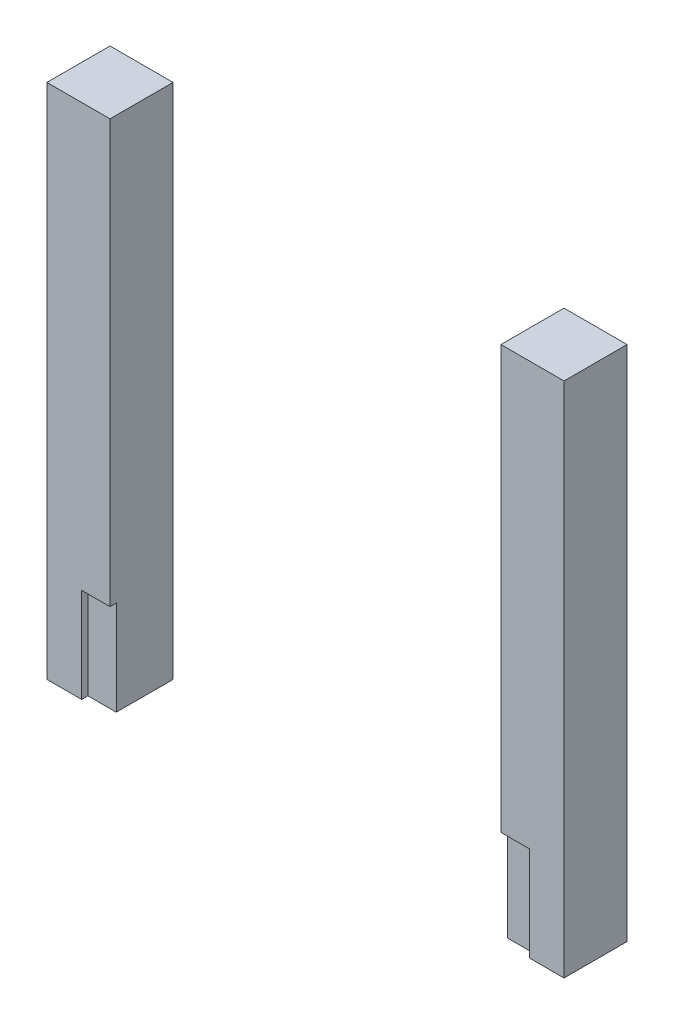
ISO-10303-21;
HEADER;
FILE_DESCRIPTION(('STEP AP214'),'2;1');
FILE_NAME('part.step','',(''),(''),'','','');
FILE_SCHEMA(('AUTOMOTIVE_DESIGN { 1 0 10303 214 1 1 1 1 }'));
ENDSEC;
DATA;
#1=APPLICATION_CONTEXT('core data for automotive mechanical design processes');
#2=APPLICATION_PROTOCOL_DEFINITION('international standard','automotive_design',2000,#1);
#3=PRODUCT_CONTEXT('',#1,'mechanical');
#4=PRODUCT('Part','Part','',(#3));
#5=PRODUCT_RELATED_PRODUCT_CATEGORY('part','',(#4));
#6=PRODUCT_DEFINITION_FORMATION('','',#4);
#7=PRODUCT_DEFINITION_CONTEXT('part definition',#1,'design');
#8=PRODUCT_DEFINITION('design','',#6,#7);
#9=PRODUCT_DEFINITION_SHAPE('','',#8);
#10=(LENGTH_UNIT() NAMED_UNIT(*) SI_UNIT(.MILLI.,.METRE.));
#11=(NAMED_UNIT(*) PLANE_ANGLE_UNIT() SI_UNIT($,.RADIAN.));
#12=(NAMED_UNIT(*) SI_UNIT($,.STERADIAN.) SOLID_ANGLE_UNIT());
#13=UNCERTAINTY_MEASURE_WITH_UNIT(LENGTH_MEASURE(1.E-05),#10,'distance_accuracy_value','');
#14=(GEOMETRIC_REPRESENTATION_CONTEXT(3) GLOBAL_UNCERTAINTY_ASSIGNED_CONTEXT((#13)) GLOBAL_UNIT_ASSIGNED_CONTEXT((#10,
#11,#12)) REPRESENTATION_CONTEXT('',''));
#15=CARTESIAN_POINT('',(0.,0.,0.));
#16=DIRECTION('',(0.,0.,1.));
#17=DIRECTION('',(1.,0.,0.));
#18=AXIS2_PLACEMENT_3D('',#15,#16,#17);
#19=CARTESIAN_POINT('',(0.,0.,50.));
#20=DIRECTION('',(0.,0.,1.));
#21=DIRECTION('',(1.,0.,0.));
#22=AXIS2_PLACEMENT_3D('',#19,#20,#21);
#23=PLANE('',#22);
#24=DIRECTION('',(0.,-1.,0.));
#25=VECTOR('',#24,1.);
#26=CARTESIAN_POINT('',(310.,410.,50.));
#27=LINE('',#26,#25);
#28=CARTESIAN_POINT('',(310.,410.,50.));
#29=VERTEX_POINT('',#28);
#30=CARTESIAN_POINT('',(310.,-260.,50.));
#31=VERTEX_POINT('',#30);
#32=EDGE_CURVE('E145',#29,#31,#27,.T.);
#33=ORIENTED_EDGE('',*,*,#32,.T.);
#34=DIRECTION('',(-1.,0.,0.));
#35=VECTOR('',#34,1.);
#36=CARTESIAN_POINT('',(-355.,-260.,50.));
#37=LINE('',#36,#35);
#38=CARTESIAN_POINT('',(355.,-260.,50.));
#39=VERTEX_POINT('',#38);
#40=EDGE_CURVE('E50',#39,#31,#37,.T.);
#41=ORIENTED_EDGE('',*,*,#40,.F.);
#42=DIRECTION('',(0.,1.,0.));
#43=VECTOR('',#42,1.);
#44=CARTESIAN_POINT('',(355.,-260.,50.));
#45=LINE('',#44,#43);
#46=CARTESIAN_POINT('',(355.,-410.,50.));
#47=VERTEX_POINT('',#46);
#48=EDGE_CURVE('E142',#47,#39,#45,.T.);
#49=ORIENTED_EDGE('',*,*,#48,.F.);
#50=DIRECTION('',(1.,0.,0.));
#51=VECTOR('',#50,1.);
#52=CARTESIAN_POINT('',(-410.,-410.,50.));
#53=LINE('',#52,#51);
#54=CARTESIAN_POINT('',(410.,-410.,50.));
#55=VERTEX_POINT('',#54);
#56=EDGE_CURVE('E146',#47,#55,#53,.T.);
#57=ORIENTED_EDGE('',*,*,#56,.T.);
#58=DIRECTION('',(0.,1.,0.));
#59=VECTOR('',#58,1.);
#60=CARTESIAN_POINT('',(410.,410.,50.));
#61=LINE('',#60,#59);
#62=CARTESIAN_POINT('',(410.,410.,50.));
#63=VERTEX_POINT('',#62);
#64=EDGE_CURVE('E147',#55,#63,#61,.T.);
#65=ORIENTED_EDGE('',*,*,#64,.T.);
#66=DIRECTION('',(-1.,0.,0.));
#67=VECTOR('',#66,1.);
#68=CARTESIAN_POINT('',(-410.,410.,50.));
#69=LINE('',#68,#67);
#70=EDGE_CURVE('E113',#63,#29,#69,.T.);
#71=ORIENTED_EDGE('',*,*,#70,.T.);
#72=EDGE_LOOP('',(#33,#41,#49,#57,#65,#71));
#73=FACE_BOUND('',#72,.T.);
#74=ADVANCED_FACE('F47',(#73),#23,.T.);
#75=CARTESIAN_POINT('',(0.,0.,-50.));
#76=DIRECTION('',(0.,0.,1.));
#77=DIRECTION('',(1.,0.,0.));
#78=AXIS2_PLACEMENT_3D('',#75,#76,#77);
#79=PLANE('',#78);
#80=DIRECTION('',(1.,0.,0.));
#81=VECTOR('',#80,1.);
#82=CARTESIAN_POINT('',(-410.,-410.,-50.));
#83=LINE('',#82,#81);
#84=CARTESIAN_POINT('',(310.,-410.,-50.));
#85=VERTEX_POINT('',#84);
#86=CARTESIAN_POINT('',(410.,-410.,-50.));
#87=VERTEX_POINT('',#86);
#88=EDGE_CURVE('E118',#85,#87,#83,.T.);
#89=ORIENTED_EDGE('',*,*,#88,.F.);
#90=DIRECTION('',(0.,1.,0.));
#91=VECTOR('',#90,1.);
#92=CARTESIAN_POINT('',(310.,310.,-50.));
#93=LINE('',#92,#91);
#94=CARTESIAN_POINT('',(310.,410.,-50.));
#95=VERTEX_POINT('',#94);
#96=EDGE_CURVE('E65',#85,#95,#93,.T.);
#97=ORIENTED_EDGE('',*,*,#96,.T.);
#98=DIRECTION('',(-1.,0.,0.));
#99=VECTOR('',#98,1.);
#100=CARTESIAN_POINT('',(-410.,410.,-50.));
#101=LINE('',#100,#99);
#102=CARTESIAN_POINT('',(410.,410.,-50.));
#103=VERTEX_POINT('',#102);
#104=EDGE_CURVE('E112',#103,#95,#101,.T.);
#105=ORIENTED_EDGE('',*,*,#104,.F.);
#106=DIRECTION('',(0.,1.,0.));
#107=VECTOR('',#106,1.);
#108=CARTESIAN_POINT('',(410.,410.,-50.));
#109=LINE('',#108,#107);
#110=EDGE_CURVE('E127',#87,#103,#109,.T.);
#111=ORIENTED_EDGE('',*,*,#110,.F.);
#112=EDGE_LOOP('',(#89,#97,#105,#111));
#113=FACE_BOUND('',#112,.T.);
#114=ADVANCED_FACE('F125',(#113),#79,.F.);
#115=CARTESIAN_POINT('',(-410.,410.,50.));
#116=DIRECTION('',(0.,-1.,0.));
#117=DIRECTION('',(1.,0.,0.));
#118=AXIS2_PLACEMENT_3D('',#115,#116,#117);
#119=PLANE('',#118);
#120=ORIENTED_EDGE('',*,*,#104,.T.);
#121=DIRECTION('',(0.,0.,-1.));
#122=VECTOR('',#121,1.);
#123=CARTESIAN_POINT('',(310.,410.,50.));
#124=LINE('',#123,#122);
#125=EDGE_CURVE('E12',#29,#95,#124,.T.);
#126=ORIENTED_EDGE('',*,*,#125,.F.);
#127=ORIENTED_EDGE('',*,*,#70,.F.);
#128=DIRECTION('',(0.,0.,-1.));
#129=VECTOR('',#128,1.);
#130=CARTESIAN_POINT('',(410.,410.,50.));
#131=LINE('',#130,#129);
#132=EDGE_CURVE('E122',#63,#103,#131,.T.);
#133=ORIENTED_EDGE('',*,*,#132,.T.);
#134=EDGE_LOOP('',(#120,#126,#127,#133));
#135=FACE_BOUND('',#134,.T.);
#136=ADVANCED_FACE('F169',(#135),#119,.F.);
#137=CARTESIAN_POINT('',(-410.,-410.,50.));
#138=DIRECTION('',(0.,1.,0.));
#139=DIRECTION('',(0.,0.,1.));
#140=AXIS2_PLACEMENT_3D('',#137,#138,#139);
#141=PLANE('',#140);
#142=DIRECTION('',(1.,0.,0.));
#143=VECTOR('',#142,1.);
#144=CARTESIAN_POINT('',(-355.,-410.,40.));
#145=LINE('',#144,#143);
#146=CARTESIAN_POINT('',(310.,-410.,40.));
#147=VERTEX_POINT('',#146);
#148=CARTESIAN_POINT('',(355.,-410.,40.));
#149=VERTEX_POINT('',#148);
#150=EDGE_CURVE('E121',#147,#149,#145,.T.);
#151=ORIENTED_EDGE('',*,*,#150,.F.);
#152=DIRECTION('',(0.,0.,-1.));
#153=VECTOR('',#152,1.);
#154=CARTESIAN_POINT('',(310.,-410.,50.));
#155=LINE('',#154,#153);
#156=EDGE_CURVE('E108',#147,#85,#155,.T.);
#157=ORIENTED_EDGE('',*,*,#156,.T.);
#158=ORIENTED_EDGE('',*,*,#88,.T.);
#159=DIRECTION('',(0.,0.,-1.));
#160=VECTOR('',#159,1.);
#161=CARTESIAN_POINT('',(410.,-410.,50.));
#162=LINE('',#161,#160);
#163=EDGE_CURVE('E137',#55,#87,#162,.T.);
#164=ORIENTED_EDGE('',*,*,#163,.F.);
#165=ORIENTED_EDGE('',*,*,#56,.F.);
#166=DIRECTION('',(0.,0.,1.));
#167=VECTOR('',#166,1.);
#168=CARTESIAN_POINT('',(355.,-410.,40.));
#169=LINE('',#168,#167);
#170=EDGE_CURVE('E56',#149,#47,#169,.T.);
#171=ORIENTED_EDGE('',*,*,#170,.F.);
#172=EDGE_LOOP('',(#151,#157,#158,#164,#165,#171));
#173=FACE_BOUND('',#172,.T.);
#174=ADVANCED_FACE('F116',(#173),#141,.F.);
#175=CARTESIAN_POINT('',(0.,0.,40.));
#176=DIRECTION('',(0.,0.,1.));
#177=DIRECTION('',(1.,0.,0.));
#178=AXIS2_PLACEMENT_3D('',#175,#176,#177);
#179=PLANE('',#178);
#180=DIRECTION('',(0.,1.,0.));
#181=VECTOR('',#180,1.);
#182=CARTESIAN_POINT('',(310.,310.,40.));
#183=LINE('',#182,#181);
#184=CARTESIAN_POINT('',(310.,-260.,40.));
#185=VERTEX_POINT('',#184);
#186=EDGE_CURVE('E102',#147,#185,#183,.T.);
#187=ORIENTED_EDGE('',*,*,#186,.F.);
#188=ORIENTED_EDGE('',*,*,#150,.T.);
#189=DIRECTION('',(0.,1.,0.));
#190=VECTOR('',#189,1.);
#191=CARTESIAN_POINT('',(355.,-260.,40.));
#192=LINE('',#191,#190);
#193=CARTESIAN_POINT('',(355.,-260.,40.));
#194=VERTEX_POINT('',#193);
#195=EDGE_CURVE('E129',#149,#194,#192,.T.);
#196=ORIENTED_EDGE('',*,*,#195,.T.);
#197=DIRECTION('',(-1.,0.,0.));
#198=VECTOR('',#197,1.);
#199=CARTESIAN_POINT('',(-355.,-260.,40.));
#200=LINE('',#199,#198);
#201=EDGE_CURVE('E134',#194,#185,#200,.T.);
#202=ORIENTED_EDGE('',*,*,#201,.T.);
#203=EDGE_LOOP('',(#187,#188,#196,#202));
#204=FACE_BOUND('',#203,.T.);
#205=ADVANCED_FACE('F182',(#204),#179,.T.);
#206=CARTESIAN_POINT('',(410.,410.,50.));
#207=DIRECTION('',(-1.,0.,0.));
#208=DIRECTION('',(0.,-1.,0.));
#209=AXIS2_PLACEMENT_3D('',#206,#207,#208);
#210=PLANE('',#209);
#211=ORIENTED_EDGE('',*,*,#110,.T.);
#212=ORIENTED_EDGE('',*,*,#132,.F.);
#213=ORIENTED_EDGE('',*,*,#64,.F.);
#214=ORIENTED_EDGE('',*,*,#163,.T.);
#215=EDGE_LOOP('',(#211,#212,#213,#214));
#216=FACE_BOUND('',#215,.T.);
#217=ADVANCED_FACE('F184',(#216),#210,.F.);
#218=CARTESIAN_POINT('',(310.,310.,50.));
#219=DIRECTION('',(-1.,0.,0.));
#220=DIRECTION('',(0.,-1.,0.));
#221=AXIS2_PLACEMENT_3D('',#218,#219,#220);
#222=PLANE('',#221);
#223=DIRECTION('',(0.,0.,-1.));
#224=VECTOR('',#223,1.);
#225=CARTESIAN_POINT('',(310.,-260.,50.));
#226=LINE('',#225,#224);
#227=EDGE_CURVE('E158',#31,#185,#226,.T.);
#228=ORIENTED_EDGE('',*,*,#227,.F.);
#229=ORIENTED_EDGE('',*,*,#32,.F.);
#230=ORIENTED_EDGE('',*,*,#125,.T.);
#231=ORIENTED_EDGE('',*,*,#96,.F.);
#232=ORIENTED_EDGE('',*,*,#156,.F.);
#233=ORIENTED_EDGE('',*,*,#186,.T.);
#234=EDGE_LOOP('',(#228,#229,#230,#231,#232,#233));
#235=FACE_BOUND('',#234,.T.);
#236=ADVANCED_FACE('F107',(#235),#222,.T.);
#237=CARTESIAN_POINT('',(-355.,-260.,40.));
#238=DIRECTION('',(0.,1.,0.));
#239=DIRECTION('',(0.,0.,1.));
#240=AXIS2_PLACEMENT_3D('',#237,#238,#239);
#241=PLANE('',#240);
#242=ORIENTED_EDGE('',*,*,#227,.T.);
#243=ORIENTED_EDGE('',*,*,#201,.F.);
#244=DIRECTION('',(0.,0.,1.));
#245=VECTOR('',#244,1.);
#246=CARTESIAN_POINT('',(355.,-260.,40.));
#247=LINE('',#246,#245);
#248=EDGE_CURVE('E160',#194,#39,#247,.T.);
#249=ORIENTED_EDGE('',*,*,#248,.T.);
#250=ORIENTED_EDGE('',*,*,#40,.T.);
#251=EDGE_LOOP('',(#242,#243,#249,#250));
#252=FACE_BOUND('',#251,.T.);
#253=ADVANCED_FACE('F167',(#252),#241,.F.);
#254=CARTESIAN_POINT('',(355.,-260.,40.));
#255=DIRECTION('',(1.,0.,0.));
#256=DIRECTION('',(0.,1.,0.));
#257=AXIS2_PLACEMENT_3D('',#254,#255,#256);
#258=PLANE('',#257);
#259=ORIENTED_EDGE('',*,*,#48,.T.);
#260=ORIENTED_EDGE('',*,*,#248,.F.);
#261=ORIENTED_EDGE('',*,*,#195,.F.);
#262=ORIENTED_EDGE('',*,*,#170,.T.);
#263=EDGE_LOOP('',(#259,#260,#261,#262));
#264=FACE_BOUND('',#263,.T.);
#265=ADVANCED_FACE('F188',(#264),#258,.F.);
#266=CLOSED_SHELL('',(#74,#114,#136,#174,#205,#217,#236,#253,#265));
#267=MANIFOLD_SOLID_BREP('B2',#266);
#268=CARTESIAN_POINT('',(-410.,410.,50.));
#269=DIRECTION('',(1.,0.,0.));
#270=DIRECTION('',(0.,1.,0.));
#271=AXIS2_PLACEMENT_3D('',#268,#269,#270);
#272=PLANE('',#271);
#273=DIRECTION('',(0.,-1.,0.));
#274=VECTOR('',#273,1.);
#275=CARTESIAN_POINT('',(-410.,410.,-50.));
#276=LINE('',#275,#274);
#277=CARTESIAN_POINT('',(-410.,410.,-50.));
#278=VERTEX_POINT('',#277);
#279=CARTESIAN_POINT('',(-410.,-410.,-50.));
#280=VERTEX_POINT('',#279);
#281=EDGE_CURVE('E343',#278,#280,#276,.T.);
#282=ORIENTED_EDGE('',*,*,#281,.T.);
#283=DIRECTION('',(0.,0.,-1.));
#284=VECTOR('',#283,1.);
#285=CARTESIAN_POINT('',(-410.,-410.,50.));
#286=LINE('',#285,#284);
#287=CARTESIAN_POINT('',(-410.,-410.,50.));
#288=VERTEX_POINT('',#287);
#289=EDGE_CURVE('E341',#288,#280,#286,.T.);
#290=ORIENTED_EDGE('',*,*,#289,.F.);
#291=DIRECTION('',(0.,-1.,0.));
#292=VECTOR('',#291,1.);
#293=CARTESIAN_POINT('',(-410.,410.,50.));
#294=LINE('',#293,#292);
#295=CARTESIAN_POINT('',(-410.,410.,50.));
#296=VERTEX_POINT('',#295);
#297=EDGE_CURVE('E272',#296,#288,#294,.T.);
#298=ORIENTED_EDGE('',*,*,#297,.F.);
#299=DIRECTION('',(0.,0.,-1.));
#300=VECTOR('',#299,1.);
#301=CARTESIAN_POINT('',(-410.,410.,50.));
#302=LINE('',#301,#300);
#303=EDGE_CURVE('E264',#296,#278,#302,.T.);
#304=ORIENTED_EDGE('',*,*,#303,.T.);
#305=EDGE_LOOP('',(#282,#290,#298,#304));
#306=FACE_BOUND('',#305,.T.);
#307=ADVANCED_FACE('F255',(#306),#272,.F.);
#308=CARTESIAN_POINT('',(-355.,-260.,40.));
#309=DIRECTION('',(-1.,0.,0.));
#310=DIRECTION('',(0.,-1.,0.));
#311=AXIS2_PLACEMENT_3D('',#308,#309,#310);
#312=PLANE('',#311);
#313=DIRECTION('',(0.,-1.,0.));
#314=VECTOR('',#313,1.);
#315=CARTESIAN_POINT('',(-355.,-260.,50.));
#316=LINE('',#315,#314);
#317=CARTESIAN_POINT('',(-355.,-260.,50.));
#318=VERTEX_POINT('',#317);
#319=CARTESIAN_POINT('',(-355.,-410.,50.));
#320=VERTEX_POINT('',#319);
#321=EDGE_CURVE('E362',#318,#320,#316,.T.);
#322=ORIENTED_EDGE('',*,*,#321,.T.);
#323=DIRECTION('',(0.,0.,1.));
#324=VECTOR('',#323,1.);
#325=CARTESIAN_POINT('',(-355.,-410.,40.));
#326=LINE('',#325,#324);
#327=CARTESIAN_POINT('',(-355.,-410.,40.));
#328=VERTEX_POINT('',#327);
#329=EDGE_CURVE('E370',#328,#320,#326,.T.);
#330=ORIENTED_EDGE('',*,*,#329,.F.);
#331=DIRECTION('',(0.,-1.,0.));
#332=VECTOR('',#331,1.);
#333=CARTESIAN_POINT('',(-355.,-260.,40.));
#334=LINE('',#333,#332);
#335=CARTESIAN_POINT('',(-355.,-260.,40.));
#336=VERTEX_POINT('',#335);
#337=EDGE_CURVE('E361',#336,#328,#334,.T.);
#338=ORIENTED_EDGE('',*,*,#337,.F.);
#339=DIRECTION('',(0.,0.,1.));
#340=VECTOR('',#339,1.);
#341=CARTESIAN_POINT('',(-355.,-260.,40.));
#342=LINE('',#341,#340);
#343=EDGE_CURVE('E367',#336,#318,#342,.T.);
#344=ORIENTED_EDGE('',*,*,#343,.T.);
#345=EDGE_LOOP('',(#322,#330,#338,#344));
#346=FACE_BOUND('',#345,.T.);
#347=ADVANCED_FACE('F379',(#346),#312,.F.);
#348=CARTESIAN_POINT('',(-355.,-260.,40.));
#349=DIRECTION('',(0.,1.,0.));
#350=DIRECTION('',(0.,0.,1.));
#351=AXIS2_PLACEMENT_3D('',#348,#349,#350);
#352=PLANE('',#351);
#353=DIRECTION('',(0.,0.,1.));
#354=VECTOR('',#353,1.);
#355=CARTESIAN_POINT('',(-310.,-260.,50.));
#356=LINE('',#355,#354);
#357=CARTESIAN_POINT('',(-310.,-260.,40.));
#358=VERTEX_POINT('',#357);
#359=CARTESIAN_POINT('',(-310.,-260.,50.));
#360=VERTEX_POINT('',#359);
#361=EDGE_CURVE('E45',#358,#360,#356,.T.);
#362=ORIENTED_EDGE('',*,*,#361,.T.);
#363=DIRECTION('',(-1.,0.,0.));
#364=VECTOR('',#363,1.);
#365=CARTESIAN_POINT('',(-355.,-260.,50.));
#366=LINE('',#365,#364);
#367=EDGE_CURVE('E335',#360,#318,#366,.T.);
#368=ORIENTED_EDGE('',*,*,#367,.T.);
#369=ORIENTED_EDGE('',*,*,#343,.F.);
#370=DIRECTION('',(-1.,0.,0.));
#371=VECTOR('',#370,1.);
#372=CARTESIAN_POINT('',(-355.,-260.,40.));
#373=LINE('',#372,#371);
#374=EDGE_CURVE('E359',#358,#336,#373,.T.);
#375=ORIENTED_EDGE('',*,*,#374,.F.);
#376=EDGE_LOOP('',(#362,#368,#369,#375));
#377=FACE_BOUND('',#376,.T.);
#378=ADVANCED_FACE('F383',(#377),#352,.F.);
#379=CARTESIAN_POINT('',(-410.,410.,50.));
#380=DIRECTION('',(0.,-1.,0.));
#381=DIRECTION('',(1.,0.,0.));
#382=AXIS2_PLACEMENT_3D('',#379,#380,#381);
#383=PLANE('',#382);
#384=DIRECTION('',(-1.,0.,0.));
#385=VECTOR('',#384,1.);
#386=CARTESIAN_POINT('',(-410.,410.,50.));
#387=LINE('',#386,#385);
#388=CARTESIAN_POINT('',(-310.,410.,50.));
#389=VERTEX_POINT('',#388);
#390=EDGE_CURVE('E342',#389,#296,#387,.T.);
#391=ORIENTED_EDGE('',*,*,#390,.F.);
#392=DIRECTION('',(0.,0.,-1.));
#393=VECTOR('',#392,1.);
#394=CARTESIAN_POINT('',(-310.,410.,50.));
#395=LINE('',#394,#393);
#396=CARTESIAN_POINT('',(-310.,410.,-50.));
#397=VERTEX_POINT('',#396);
#398=EDGE_CURVE('E336',#389,#397,#395,.T.);
#399=ORIENTED_EDGE('',*,*,#398,.T.);
#400=DIRECTION('',(-1.,0.,0.));
#401=VECTOR('',#400,1.);
#402=CARTESIAN_POINT('',(-410.,410.,-50.));
#403=LINE('',#402,#401);
#404=EDGE_CURVE('E283',#397,#278,#403,.T.);
#405=ORIENTED_EDGE('',*,*,#404,.T.);
#406=ORIENTED_EDGE('',*,*,#303,.F.);
#407=EDGE_LOOP('',(#391,#399,#405,#406));
#408=FACE_BOUND('',#407,.T.);
#409=ADVANCED_FACE('F257',(#408),#383,.F.);
#410=CARTESIAN_POINT('',(0.,0.,40.));
#411=DIRECTION('',(0.,0.,1.));
#412=DIRECTION('',(1.,0.,0.));
#413=AXIS2_PLACEMENT_3D('',#410,#411,#412);
#414=PLANE('',#413);
#415=DIRECTION('',(1.,0.,0.));
#416=VECTOR('',#415,1.);
#417=CARTESIAN_POINT('',(-355.,-410.,40.));
#418=LINE('',#417,#416);
#419=CARTESIAN_POINT('',(-310.,-410.,40.));
#420=VERTEX_POINT('',#419);
#421=EDGE_CURVE('E365',#328,#420,#418,.T.);
#422=ORIENTED_EDGE('',*,*,#421,.T.);
#423=DIRECTION('',(0.,-1.,0.));
#424=VECTOR('',#423,1.);
#425=CARTESIAN_POINT('',(-310.,310.,40.));
#426=LINE('',#425,#424);
#427=EDGE_CURVE('E292',#358,#420,#426,.T.);
#428=ORIENTED_EDGE('',*,*,#427,.F.);
#429=ORIENTED_EDGE('',*,*,#374,.T.);
#430=ORIENTED_EDGE('',*,*,#337,.T.);
#431=EDGE_LOOP('',(#422,#428,#429,#430));
#432=FACE_BOUND('',#431,.T.);
#433=ADVANCED_FACE('F380',(#432),#414,.T.);
#434=CARTESIAN_POINT('',(-310.,310.,50.));
#435=DIRECTION('',(1.,0.,0.));
#436=DIRECTION('',(0.,1.,0.));
#437=AXIS2_PLACEMENT_3D('',#434,#435,#436);
#438=PLANE('',#437);
#439=ORIENTED_EDGE('',*,*,#361,.F.);
#440=ORIENTED_EDGE('',*,*,#427,.T.);
#441=DIRECTION('',(0.,0.,-1.));
#442=VECTOR('',#441,1.);
#443=CARTESIAN_POINT('',(-310.,-410.,50.));
#444=LINE('',#443,#442);
#445=CARTESIAN_POINT('',(-310.,-410.,-50.));
#446=VERTEX_POINT('',#445);
#447=EDGE_CURVE('E330',#420,#446,#444,.T.);
#448=ORIENTED_EDGE('',*,*,#447,.T.);
#449=DIRECTION('',(0.,-1.,0.));
#450=VECTOR('',#449,1.);
#451=CARTESIAN_POINT('',(-310.,310.,-50.));
#452=LINE('',#451,#450);
#453=EDGE_CURVE('E319',#397,#446,#452,.T.);
#454=ORIENTED_EDGE('',*,*,#453,.F.);
#455=ORIENTED_EDGE('',*,*,#398,.F.);
#456=DIRECTION('',(0.,-1.,0.));
#457=VECTOR('',#456,1.);
#458=CARTESIAN_POINT('',(-310.,310.,50.));
#459=LINE('',#458,#457);
#460=EDGE_CURVE('E327',#389,#360,#459,.T.);
#461=ORIENTED_EDGE('',*,*,#460,.T.);
#462=EDGE_LOOP('',(#439,#440,#448,#454,#455,#461));
#463=FACE_BOUND('',#462,.T.);
#464=ADVANCED_FACE('F332',(#463),#438,.T.);
#465=CARTESIAN_POINT('',(-410.,-410.,50.));
#466=DIRECTION('',(0.,1.,0.));
#467=DIRECTION('',(0.,0.,1.));
#468=AXIS2_PLACEMENT_3D('',#465,#466,#467);
#469=PLANE('',#468);
#470=DIRECTION('',(1.,0.,0.));
#471=VECTOR('',#470,1.);
#472=CARTESIAN_POINT('',(-410.,-410.,-50.));
#473=LINE('',#472,#471);
#474=EDGE_CURVE('E324',#280,#446,#473,.T.);
#475=ORIENTED_EDGE('',*,*,#474,.T.);
#476=ORIENTED_EDGE('',*,*,#447,.F.);
#477=ORIENTED_EDGE('',*,*,#421,.F.);
#478=ORIENTED_EDGE('',*,*,#329,.T.);
#479=DIRECTION('',(1.,0.,0.));
#480=VECTOR('',#479,1.);
#481=CARTESIAN_POINT('',(-410.,-410.,50.));
#482=LINE('',#481,#480);
#483=EDGE_CURVE('E349',#288,#320,#482,.T.);
#484=ORIENTED_EDGE('',*,*,#483,.F.);
#485=ORIENTED_EDGE('',*,*,#289,.T.);
#486=EDGE_LOOP('',(#475,#476,#477,#478,#484,#485));
#487=FACE_BOUND('',#486,.T.);
#488=ADVANCED_FACE('F339',(#487),#469,.F.);
#489=CARTESIAN_POINT('',(0.,0.,-50.));
#490=DIRECTION('',(0.,0.,1.));
#491=DIRECTION('',(1.,0.,0.));
#492=AXIS2_PLACEMENT_3D('',#489,#490,#491);
#493=PLANE('',#492);
#494=ORIENTED_EDGE('',*,*,#453,.T.);
#495=ORIENTED_EDGE('',*,*,#474,.F.);
#496=ORIENTED_EDGE('',*,*,#281,.F.);
#497=ORIENTED_EDGE('',*,*,#404,.F.);
#498=EDGE_LOOP('',(#494,#495,#496,#497));
#499=FACE_BOUND('',#498,.T.);
#500=ADVANCED_FACE('F321',(#499),#493,.F.);
#501=CARTESIAN_POINT('',(0.,0.,50.));
#502=DIRECTION('',(0.,0.,1.));
#503=DIRECTION('',(1.,0.,0.));
#504=AXIS2_PLACEMENT_3D('',#501,#502,#503);
#505=PLANE('',#504);
#506=ORIENTED_EDGE('',*,*,#460,.F.);
#507=ORIENTED_EDGE('',*,*,#390,.T.);
#508=ORIENTED_EDGE('',*,*,#297,.T.);
#509=ORIENTED_EDGE('',*,*,#483,.T.);
#510=ORIENTED_EDGE('',*,*,#321,.F.);
#511=ORIENTED_EDGE('',*,*,#367,.F.);
#512=EDGE_LOOP('',(#506,#507,#508,#509,#510,#511));
#513=FACE_BOUND('',#512,.T.);
#514=ADVANCED_FACE('F352',(#513),#505,.T.);
#515=CLOSED_SHELL('',(#307,#347,#378,#409,#433,#464,#488,#500,#514));
#516=MANIFOLD_SOLID_BREP('B6',#515);
#517=ADVANCED_BREP_SHAPE_REPRESENTATION('',(#18,#267,#516),#14);
#518=SHAPE_DEFINITION_REPRESENTATION(#9,#517);
ENDSEC;
END-ISO-10303-21;
